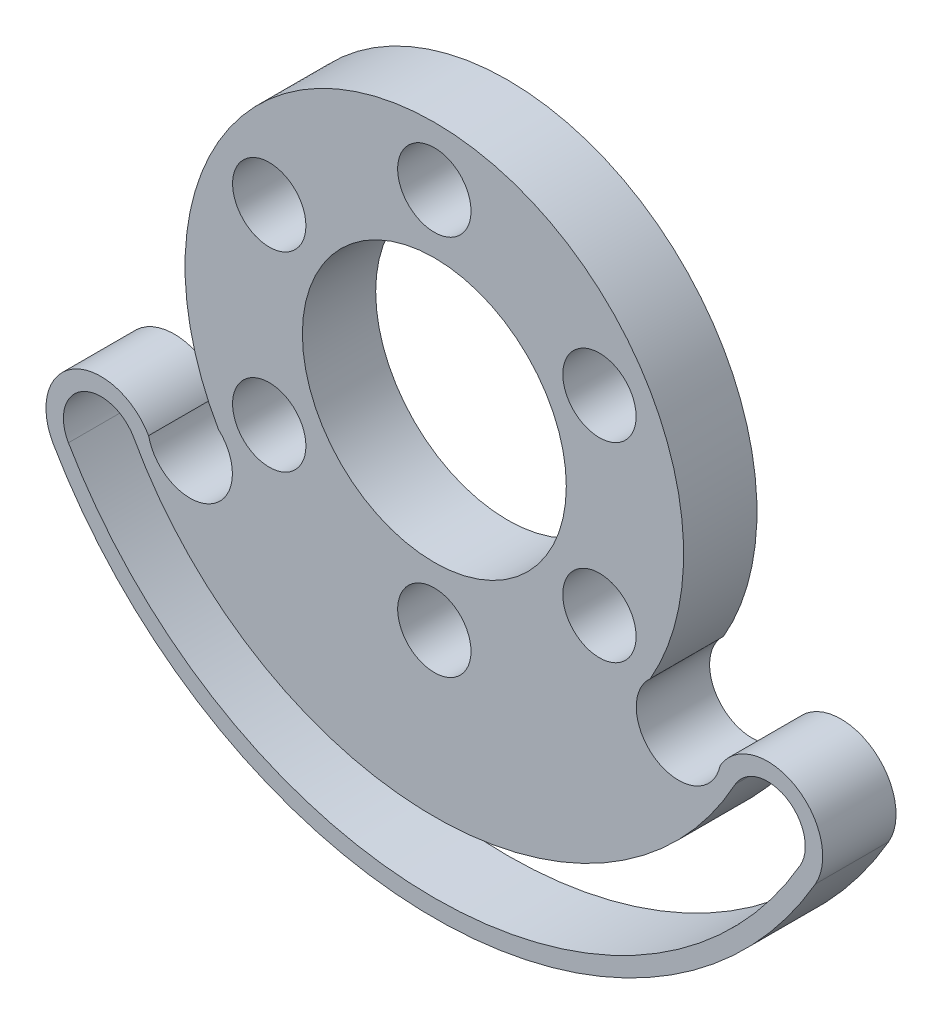
ISO-10303-21;
HEADER;
FILE_DESCRIPTION(('STEP AP214'),'2;1');
FILE_NAME('part.step','',(''),(''),'','','');
FILE_SCHEMA(('AUTOMOTIVE_DESIGN { 1 0 10303 214 1 1 1 1 }'));
ENDSEC;
DATA;
#1=APPLICATION_CONTEXT('core data for automotive mechanical design processes');
#2=APPLICATION_PROTOCOL_DEFINITION('international standard','automotive_design',2000,#1);
#3=PRODUCT_CONTEXT('',#1,'mechanical');
#4=PRODUCT('Part','Part','',(#3));
#5=PRODUCT_RELATED_PRODUCT_CATEGORY('part','',(#4));
#6=PRODUCT_DEFINITION_FORMATION('','',#4);
#7=PRODUCT_DEFINITION_CONTEXT('part definition',#1,'design');
#8=PRODUCT_DEFINITION('design','',#6,#7);
#9=PRODUCT_DEFINITION_SHAPE('','',#8);
#10=(LENGTH_UNIT() NAMED_UNIT(*) SI_UNIT(.MILLI.,.METRE.));
#11=(NAMED_UNIT(*) PLANE_ANGLE_UNIT() SI_UNIT($,.RADIAN.));
#12=(NAMED_UNIT(*) SI_UNIT($,.STERADIAN.) SOLID_ANGLE_UNIT());
#13=UNCERTAINTY_MEASURE_WITH_UNIT(LENGTH_MEASURE(1.E-05),#10,'distance_accuracy_value','');
#14=(GEOMETRIC_REPRESENTATION_CONTEXT(3) GLOBAL_UNCERTAINTY_ASSIGNED_CONTEXT((#13)) GLOBAL_UNIT_ASSIGNED_CONTEXT((#10,
#11,#12)) REPRESENTATION_CONTEXT('',''));
#15=CARTESIAN_POINT('',(0.,0.,0.));
#16=DIRECTION('',(0.,0.,1.));
#17=DIRECTION('',(1.,0.,0.));
#18=AXIS2_PLACEMENT_3D('',#15,#16,#17);
#19=CARTESIAN_POINT('',(0.,0.,-10.));
#20=DIRECTION('',(0.,0.,1.));
#21=DIRECTION('',(1.,0.,0.));
#22=AXIS2_PLACEMENT_3D('',#19,#20,#21);
#23=CYLINDRICAL_SURFACE('',#22,57.6241701090197);
#24=CARTESIAN_POINT('',(0.,0.,0.));
#25=DIRECTION('',(0.,0.,1.));
#26=DIRECTION('',(1.,0.,0.));
#27=AXIS2_PLACEMENT_3D('',#24,#25,#26);
#28=CIRCLE('',#27,57.6241701090197);
#29=CARTESIAN_POINT('',(-49.903995186407,-28.8120850545098,0.));
#30=VERTEX_POINT('',#29);
#31=CARTESIAN_POINT('',(49.903995186407,-28.8120850545099,0.));
#32=VERTEX_POINT('',#31);
#33=EDGE_CURVE('E185',#30,#32,#28,.T.);
#34=ORIENTED_EDGE('',*,*,#33,.T.);
#35=DIRECTION('',(0.,0.,1.));
#36=VECTOR('',#35,1.);
#37=CARTESIAN_POINT('',(49.903995186407,-28.8120850545099,-10.));
#38=LINE('',#37,#36);
#39=CARTESIAN_POINT('',(49.903995186407,-28.8120850545099,-10.));
#40=VERTEX_POINT('',#39);
#41=EDGE_CURVE('E11',#40,#32,#38,.T.);
#42=ORIENTED_EDGE('',*,*,#41,.F.);
#43=CARTESIAN_POINT('',(0.,0.,-10.));
#44=DIRECTION('',(0.,0.,1.));
#45=DIRECTION('',(1.,0.,0.));
#46=AXIS2_PLACEMENT_3D('',#43,#44,#45);
#47=CIRCLE('',#46,57.6241701090197);
#48=CARTESIAN_POINT('',(-49.903995186407,-28.8120850545098,-10.));
#49=VERTEX_POINT('',#48);
#50=EDGE_CURVE('E58',#49,#40,#47,.T.);
#51=ORIENTED_EDGE('',*,*,#50,.F.);
#52=DIRECTION('',(0.,0.,1.));
#53=VECTOR('',#52,1.);
#54=CARTESIAN_POINT('',(-49.903995186407,-28.8120850545098,-10.));
#55=LINE('',#54,#53);
#56=EDGE_CURVE('E133',#49,#30,#55,.T.);
#57=ORIENTED_EDGE('',*,*,#56,.T.);
#58=EDGE_LOOP('',(#34,#42,#51,#57));
#59=FACE_BOUND('',#58,.T.);
#60=ADVANCED_FACE('F39',(#59),#23,.F.);
#61=CARTESIAN_POINT('',(45.466333698683,-26.25,-10.));
#62=DIRECTION('',(0.,0.,1.));
#63=DIRECTION('',(1.,0.,0.));
#64=AXIS2_PLACEMENT_3D('',#61,#62,#63);
#65=CYLINDRICAL_SURFACE('',#64,5.12417010901976);
#66=CARTESIAN_POINT('',(45.466333698683,-26.25,0.));
#67=DIRECTION('',(0.,0.,1.));
#68=DIRECTION('',(1.,0.,0.));
#69=AXIS2_PLACEMENT_3D('',#66,#67,#68);
#70=CIRCLE('',#69,5.12417010901976);
#71=CARTESIAN_POINT('',(41.0286722109591,-23.6879149454901,0.));
#72=VERTEX_POINT('',#71);
#73=EDGE_CURVE('E190',#72,#32,#70,.F.);
#74=ORIENTED_EDGE('',*,*,#73,.F.);
#75=DIRECTION('',(0.,0.,1.));
#76=VECTOR('',#75,1.);
#77=CARTESIAN_POINT('',(41.0286722109591,-23.6879149454901,-10.));
#78=LINE('',#77,#76);
#79=CARTESIAN_POINT('',(41.0286722109591,-23.6879149454901,-10.));
#80=VERTEX_POINT('',#79);
#81=EDGE_CURVE('E49',#80,#72,#78,.T.);
#82=ORIENTED_EDGE('',*,*,#81,.F.);
#83=CARTESIAN_POINT('',(45.466333698683,-26.25,-10.));
#84=DIRECTION('',(0.,0.,1.));
#85=DIRECTION('',(1.,0.,0.));
#86=AXIS2_PLACEMENT_3D('',#83,#84,#85);
#87=CIRCLE('',#86,5.12417010901976);
#88=EDGE_CURVE('E138',#80,#40,#87,.F.);
#89=ORIENTED_EDGE('',*,*,#88,.T.);
#90=ORIENTED_EDGE('',*,*,#41,.T.);
#91=EDGE_LOOP('',(#74,#82,#89,#90));
#92=FACE_BOUND('',#91,.T.);
#93=ADVANCED_FACE('F240',(#92),#65,.F.);
#94=CARTESIAN_POINT('',(0.,-1.28493078490825,-10.));
#95=DIRECTION('',(0.,0.,1.));
#96=DIRECTION('',(1.,0.,0.));
#97=AXIS2_PLACEMENT_3D('',#94,#95,#96);
#98=CYLINDRICAL_SURFACE('',#97,46.7466110289677);
#99=CARTESIAN_POINT('',(0.,-1.28493078490825,0.));
#100=DIRECTION('',(0.,0.,1.));
#101=DIRECTION('',(1.,0.,0.));
#102=AXIS2_PLACEMENT_3D('',#99,#100,#101);
#103=CIRCLE('',#102,46.7466110289677);
#104=CARTESIAN_POINT('',(-41.0286722109591,-23.6879149454901,0.));
#105=VERTEX_POINT('',#104);
#106=EDGE_CURVE('E128',#105,#72,#103,.T.);
#107=ORIENTED_EDGE('',*,*,#106,.F.);
#108=DIRECTION('',(0.,0.,1.));
#109=VECTOR('',#108,1.);
#110=CARTESIAN_POINT('',(-41.0286722109591,-23.6879149454901,-10.));
#111=LINE('',#110,#109);
#112=CARTESIAN_POINT('',(-41.0286722109591,-23.6879149454901,-10.));
#113=VERTEX_POINT('',#112);
#114=EDGE_CURVE('E124',#113,#105,#111,.T.);
#115=ORIENTED_EDGE('',*,*,#114,.F.);
#116=CARTESIAN_POINT('',(0.,-1.28493078490825,-10.));
#117=DIRECTION('',(0.,0.,1.));
#118=DIRECTION('',(1.,0.,0.));
#119=AXIS2_PLACEMENT_3D('',#116,#117,#118);
#120=CIRCLE('',#119,46.7466110289677);
#121=EDGE_CURVE('E127',#113,#80,#120,.T.);
#122=ORIENTED_EDGE('',*,*,#121,.T.);
#123=ORIENTED_EDGE('',*,*,#81,.T.);
#124=EDGE_LOOP('',(#107,#115,#122,#123));
#125=FACE_BOUND('',#124,.T.);
#126=ADVANCED_FACE('F126',(#125),#98,.T.);
#127=CARTESIAN_POINT('',(33.3194090538244,-21.2890906406057,-10.));
#128=DIRECTION('',(0.,0.,1.));
#129=DIRECTION('',(1.,0.,0.));
#130=AXIS2_PLACEMENT_3D('',#127,#128,#129);
#131=CYLINDRICAL_SURFACE('',#130,5.77999999999998);
#132=CARTESIAN_POINT('',(33.3194090538244,-21.2890906406057,0.));
#133=DIRECTION('',(0.,0.,1.));
#134=DIRECTION('',(1.,0.,0.));
#135=AXIS2_PLACEMENT_3D('',#132,#133,#134);
#136=CIRCLE('',#135,5.77999999999998);
#137=CARTESIAN_POINT('',(29.4448637286708,-17.0000000000001,0.));
#138=VERTEX_POINT('',#137);
#139=CARTESIAN_POINT('',(38.9711431702997,-22.5,0.));
#140=VERTEX_POINT('',#139);
#141=EDGE_CURVE('E168',#138,#140,#136,.T.);
#142=ORIENTED_EDGE('',*,*,#141,.T.);
#143=DIRECTION('',(0.,0.,1.));
#144=VECTOR('',#143,1.);
#145=CARTESIAN_POINT('',(38.9711431702997,-22.5,-10.));
#146=LINE('',#145,#144);
#147=CARTESIAN_POINT('',(38.9711431702997,-22.5,-10.));
#148=VERTEX_POINT('',#147);
#149=EDGE_CURVE('E202',#148,#140,#146,.T.);
#150=ORIENTED_EDGE('',*,*,#149,.F.);
#151=CARTESIAN_POINT('',(33.3194090538244,-21.2890906406057,-10.));
#152=DIRECTION('',(0.,0.,1.));
#153=DIRECTION('',(1.,0.,0.));
#154=AXIS2_PLACEMENT_3D('',#151,#152,#153);
#155=CIRCLE('',#154,5.77999999999998);
#156=CARTESIAN_POINT('',(29.4448637286708,-17.0000000000001,-10.));
#157=VERTEX_POINT('',#156);
#158=EDGE_CURVE('E218',#157,#148,#155,.T.);
#159=ORIENTED_EDGE('',*,*,#158,.F.);
#160=DIRECTION('',(0.,0.,1.));
#161=VECTOR('',#160,1.);
#162=CARTESIAN_POINT('',(29.4448637286708,-17.0000000000001,-10.));
#163=LINE('',#162,#161);
#164=EDGE_CURVE('E43',#157,#138,#163,.T.);
#165=ORIENTED_EDGE('',*,*,#164,.T.);
#166=EDGE_LOOP('',(#142,#150,#159,#165));
#167=FACE_BOUND('',#166,.T.);
#168=ADVANCED_FACE('F215',(#167),#131,.F.);
#169=CARTESIAN_POINT('',(45.4663336986829,-26.2500000000002,-10.));
#170=DIRECTION('',(0.,0.,1.));
#171=DIRECTION('',(1.,0.,0.));
#172=AXIS2_PLACEMENT_3D('',#169,#170,#171);
#173=CYLINDRICAL_SURFACE('',#172,7.5);
#174=CARTESIAN_POINT('',(45.4663336986829,-26.2500000000002,0.));
#175=DIRECTION('',(0.,0.,1.));
#176=DIRECTION('',(1.,0.,0.));
#177=AXIS2_PLACEMENT_3D('',#174,#175,#176);
#178=CIRCLE('',#177,7.5);
#179=CARTESIAN_POINT('',(51.9615242270662,-30.0000000000003,0.));
#180=VERTEX_POINT('',#179);
#181=EDGE_CURVE('E182',#140,#180,#178,.F.);
#182=ORIENTED_EDGE('',*,*,#181,.T.);
#183=DIRECTION('',(0.,0.,1.));
#184=VECTOR('',#183,1.);
#185=CARTESIAN_POINT('',(51.9615242270662,-30.0000000000003,-10.));
#186=LINE('',#185,#184);
#187=CARTESIAN_POINT('',(51.9615242270662,-30.0000000000003,-10.));
#188=VERTEX_POINT('',#187);
#189=EDGE_CURVE('E205',#188,#180,#186,.T.);
#190=ORIENTED_EDGE('',*,*,#189,.F.);
#191=CARTESIAN_POINT('',(45.4663336986829,-26.2500000000002,-10.));
#192=DIRECTION('',(0.,0.,1.));
#193=DIRECTION('',(1.,0.,0.));
#194=AXIS2_PLACEMENT_3D('',#191,#192,#193);
#195=CIRCLE('',#194,7.5);
#196=EDGE_CURVE('E142',#148,#188,#195,.F.);
#197=ORIENTED_EDGE('',*,*,#196,.F.);
#198=ORIENTED_EDGE('',*,*,#149,.T.);
#199=EDGE_LOOP('',(#182,#190,#197,#198));
#200=FACE_BOUND('',#199,.T.);
#201=ADVANCED_FACE('F249',(#200),#173,.T.);
#202=CARTESIAN_POINT('',(0.,0.,-10.));
#203=DIRECTION('',(0.,0.,1.));
#204=DIRECTION('',(1.,0.,0.));
#205=AXIS2_PLACEMENT_3D('',#202,#203,#204);
#206=CYLINDRICAL_SURFACE('',#205,60.);
#207=CARTESIAN_POINT('',(0.,0.,0.));
#208=DIRECTION('',(0.,0.,1.));
#209=DIRECTION('',(1.,0.,0.));
#210=AXIS2_PLACEMENT_3D('',#207,#208,#209);
#211=CIRCLE('',#210,60.);
#212=CARTESIAN_POINT('',(-51.9615242270665,-29.9999999999997,0.));
#213=VERTEX_POINT('',#212);
#214=EDGE_CURVE('E179',#213,#180,#211,.T.);
#215=ORIENTED_EDGE('',*,*,#214,.F.);
#216=DIRECTION('',(0.,0.,1.));
#217=VECTOR('',#216,1.);
#218=CARTESIAN_POINT('',(-51.9615242270665,-29.9999999999997,-10.));
#219=LINE('',#218,#217);
#220=CARTESIAN_POINT('',(-51.9615242270665,-29.9999999999997,-10.));
#221=VERTEX_POINT('',#220);
#222=EDGE_CURVE('E207',#221,#213,#219,.T.);
#223=ORIENTED_EDGE('',*,*,#222,.F.);
#224=CARTESIAN_POINT('',(0.,0.,-10.));
#225=DIRECTION('',(0.,0.,1.));
#226=DIRECTION('',(1.,0.,0.));
#227=AXIS2_PLACEMENT_3D('',#224,#225,#226);
#228=CIRCLE('',#227,60.);
#229=EDGE_CURVE('E276',#221,#188,#228,.T.);
#230=ORIENTED_EDGE('',*,*,#229,.T.);
#231=ORIENTED_EDGE('',*,*,#189,.T.);
#232=EDGE_LOOP('',(#215,#223,#230,#231));
#233=FACE_BOUND('',#232,.T.);
#234=ADVANCED_FACE('F252',(#233),#206,.T.);
#235=CARTESIAN_POINT('',(-45.4663336986831,-26.2499999999998,-10.));
#236=DIRECTION('',(0.,0.,1.));
#237=DIRECTION('',(1.,0.,0.));
#238=AXIS2_PLACEMENT_3D('',#235,#236,#237);
#239=CYLINDRICAL_SURFACE('',#238,7.49999999999999);
#240=CARTESIAN_POINT('',(-45.4663336986831,-26.2499999999998,0.));
#241=DIRECTION('',(0.,0.,1.));
#242=DIRECTION('',(1.,0.,0.));
#243=AXIS2_PLACEMENT_3D('',#240,#241,#242);
#244=CIRCLE('',#243,7.49999999999999);
#245=CARTESIAN_POINT('',(-38.9711431702997,-22.5,0.));
#246=VERTEX_POINT('',#245);
#247=EDGE_CURVE('E177',#213,#246,#244,.F.);
#248=ORIENTED_EDGE('',*,*,#247,.T.);
#249=DIRECTION('',(0.,0.,1.));
#250=VECTOR('',#249,1.);
#251=CARTESIAN_POINT('',(-38.9711431702997,-22.5,-10.));
#252=LINE('',#251,#250);
#253=CARTESIAN_POINT('',(-38.9711431702997,-22.5,-10.));
#254=VERTEX_POINT('',#253);
#255=EDGE_CURVE('E209',#254,#246,#252,.T.);
#256=ORIENTED_EDGE('',*,*,#255,.F.);
#257=CARTESIAN_POINT('',(-45.4663336986831,-26.2499999999998,-10.));
#258=DIRECTION('',(0.,0.,1.));
#259=DIRECTION('',(1.,0.,0.));
#260=AXIS2_PLACEMENT_3D('',#257,#258,#259);
#261=CIRCLE('',#260,7.49999999999999);
#262=EDGE_CURVE('E289',#221,#254,#261,.F.);
#263=ORIENTED_EDGE('',*,*,#262,.F.);
#264=ORIENTED_EDGE('',*,*,#222,.T.);
#265=EDGE_LOOP('',(#248,#256,#263,#264));
#266=FACE_BOUND('',#265,.T.);
#267=ADVANCED_FACE('F256',(#266),#239,.T.);
#268=CARTESIAN_POINT('',(-33.3219081509298,-21.2847620774461,-10.));
#269=DIRECTION('',(0.,0.,1.));
#270=DIRECTION('',(1.,0.,0.));
#271=AXIS2_PLACEMENT_3D('',#268,#269,#270);
#272=CYLINDRICAL_SURFACE('',#271,5.77846515196629);
#273=CARTESIAN_POINT('',(-33.3219081509298,-21.2847620774461,0.));
#274=DIRECTION('',(0.,0.,1.));
#275=DIRECTION('',(1.,0.,0.));
#276=AXIS2_PLACEMENT_3D('',#273,#274,#275);
#277=CIRCLE('',#276,5.77846515196629);
#278=CARTESIAN_POINT('',(-29.444863728671,-16.9999999999999,0.));
#279=VERTEX_POINT('',#278);
#280=EDGE_CURVE('E174',#246,#279,#277,.T.);
#281=ORIENTED_EDGE('',*,*,#280,.T.);
#282=DIRECTION('',(0.,0.,1.));
#283=VECTOR('',#282,1.);
#284=CARTESIAN_POINT('',(-29.444863728671,-16.9999999999999,-10.));
#285=LINE('',#284,#283);
#286=CARTESIAN_POINT('',(-29.444863728671,-16.9999999999999,-10.));
#287=VERTEX_POINT('',#286);
#288=EDGE_CURVE('E211',#287,#279,#285,.T.);
#289=ORIENTED_EDGE('',*,*,#288,.F.);
#290=CARTESIAN_POINT('',(-33.3219081509298,-21.2847620774461,-10.));
#291=DIRECTION('',(0.,0.,1.));
#292=DIRECTION('',(1.,0.,0.));
#293=AXIS2_PLACEMENT_3D('',#290,#291,#292);
#294=CIRCLE('',#293,5.77846515196629);
#295=EDGE_CURVE('E281',#254,#287,#294,.T.);
#296=ORIENTED_EDGE('',*,*,#295,.F.);
#297=ORIENTED_EDGE('',*,*,#255,.T.);
#298=EDGE_LOOP('',(#281,#289,#296,#297));
#299=FACE_BOUND('',#298,.T.);
#300=ADVANCED_FACE('F259',(#299),#272,.F.);
#301=CARTESIAN_POINT('',(-22.5166604983955,-12.9999999999998,-10.));
#302=DIRECTION('',(0.,0.,1.));
#303=DIRECTION('',(1.,0.,0.));
#304=AXIS2_PLACEMENT_3D('',#301,#302,#303);
#305=CYLINDRICAL_SURFACE('',#304,5.);
#306=CARTESIAN_POINT('',(-22.5166604983955,-12.9999999999998,-10.));
#307=DIRECTION('',(0.,0.,1.));
#308=DIRECTION('',(1.,0.,0.));
#309=AXIS2_PLACEMENT_3D('',#306,#307,#308);
#310=CIRCLE('',#309,5.);
#311=CARTESIAN_POINT('',(-17.5166604983955,-12.9999999999998,-10.));
#312=VERTEX_POINT('',#311);
#313=EDGE_CURVE('E147',#312,#312,#310,.T.);
#314=ORIENTED_EDGE('',*,*,#313,.F.);
#315=EDGE_LOOP('',(#314));
#316=FACE_BOUND('',#315,.T.);
#317=CARTESIAN_POINT('',(-22.5166604983955,-12.9999999999998,0.));
#318=DIRECTION('',(0.,0.,1.));
#319=DIRECTION('',(1.,0.,0.));
#320=AXIS2_PLACEMENT_3D('',#317,#318,#319);
#321=CIRCLE('',#320,5.);
#322=CARTESIAN_POINT('',(-17.5166604983955,-12.9999999999998,0.));
#323=VERTEX_POINT('',#322);
#324=EDGE_CURVE('E193',#323,#323,#321,.T.);
#325=ORIENTED_EDGE('',*,*,#324,.T.);
#326=EDGE_LOOP('',(#325));
#327=FACE_BOUND('',#326,.T.);
#328=ADVANCED_FACE('F235',(#316,#327),#305,.F.);
#329=CARTESIAN_POINT('',(-45.466333698683,-26.25,-10.));
#330=DIRECTION('',(0.,0.,1.));
#331=DIRECTION('',(1.,0.,0.));
#332=AXIS2_PLACEMENT_3D('',#329,#330,#331);
#333=CYLINDRICAL_SURFACE('',#332,5.12417010901974);
#334=CARTESIAN_POINT('',(-45.466333698683,-26.25,0.));
#335=DIRECTION('',(0.,0.,1.));
#336=DIRECTION('',(1.,0.,0.));
#337=AXIS2_PLACEMENT_3D('',#334,#335,#336);
#338=CIRCLE('',#337,5.12417010901974);
#339=EDGE_CURVE('E187',#30,#105,#338,.F.);
#340=ORIENTED_EDGE('',*,*,#339,.F.);
#341=ORIENTED_EDGE('',*,*,#56,.F.);
#342=CARTESIAN_POINT('',(-45.466333698683,-26.25,-10.));
#343=DIRECTION('',(0.,0.,1.));
#344=DIRECTION('',(1.,0.,0.));
#345=AXIS2_PLACEMENT_3D('',#342,#343,#344);
#346=CIRCLE('',#345,5.12417010901974);
#347=EDGE_CURVE('E137',#49,#113,#346,.F.);
#348=ORIENTED_EDGE('',*,*,#347,.T.);
#349=ORIENTED_EDGE('',*,*,#114,.T.);
#350=EDGE_LOOP('',(#340,#341,#348,#349));
#351=FACE_BOUND('',#350,.T.);
#352=ADVANCED_FACE('F140',(#351),#333,.F.);
#353=CARTESIAN_POINT('',(0.,0.,-10.));
#354=DIRECTION('',(0.,0.,1.));
#355=DIRECTION('',(1.,0.,0.));
#356=AXIS2_PLACEMENT_3D('',#353,#354,#355);
#357=CYLINDRICAL_SURFACE('',#356,34.);
#358=CARTESIAN_POINT('',(0.,0.,0.));
#359=DIRECTION('',(0.,0.,1.));
#360=DIRECTION('',(1.,0.,0.));
#361=AXIS2_PLACEMENT_3D('',#358,#359,#360);
#362=CIRCLE('',#361,34.);
#363=EDGE_CURVE('E171',#138,#279,#362,.T.);
#364=ORIENTED_EDGE('',*,*,#363,.F.);
#365=ORIENTED_EDGE('',*,*,#164,.F.);
#366=CARTESIAN_POINT('',(0.,0.,-10.));
#367=DIRECTION('',(0.,0.,1.));
#368=DIRECTION('',(1.,0.,0.));
#369=AXIS2_PLACEMENT_3D('',#366,#367,#368);
#370=CIRCLE('',#369,34.);
#371=EDGE_CURVE('E278',#157,#287,#370,.T.);
#372=ORIENTED_EDGE('',*,*,#371,.T.);
#373=ORIENTED_EDGE('',*,*,#288,.T.);
#374=EDGE_LOOP('',(#364,#365,#372,#373));
#375=FACE_BOUND('',#374,.T.);
#376=ADVANCED_FACE('F224',(#375),#357,.T.);
#377=CARTESIAN_POINT('',(-1.81557029619843E-13,-26.,-10.));
#378=DIRECTION('',(0.,0.,1.));
#379=DIRECTION('',(1.,0.,0.));
#380=AXIS2_PLACEMENT_3D('',#377,#378,#379);
#381=CYLINDRICAL_SURFACE('',#380,5.);
#382=CARTESIAN_POINT('',(-1.81557029619843E-13,-26.,-10.));
#383=DIRECTION('',(0.,0.,1.));
#384=DIRECTION('',(1.,0.,0.));
#385=AXIS2_PLACEMENT_3D('',#382,#383,#384);
#386=CIRCLE('',#385,5.);
#387=CARTESIAN_POINT('',(4.99999999999982,-26.,-10.));
#388=VERTEX_POINT('',#387);
#389=EDGE_CURVE('E279',#388,#388,#386,.T.);
#390=ORIENTED_EDGE('',*,*,#389,.F.);
#391=EDGE_LOOP('',(#390));
#392=FACE_BOUND('',#391,.T.);
#393=CARTESIAN_POINT('',(-1.81557029619843E-13,-26.,0.));
#394=DIRECTION('',(0.,0.,1.));
#395=DIRECTION('',(1.,0.,0.));
#396=AXIS2_PLACEMENT_3D('',#393,#394,#395);
#397=CIRCLE('',#396,5.);
#398=CARTESIAN_POINT('',(4.99999999999982,-26.,0.));
#399=VERTEX_POINT('',#398);
#400=EDGE_CURVE('E165',#399,#399,#397,.T.);
#401=ORIENTED_EDGE('',*,*,#400,.T.);
#402=EDGE_LOOP('',(#401));
#403=FACE_BOUND('',#402,.T.);
#404=ADVANCED_FACE('F226',(#392,#403),#381,.F.);
#405=CARTESIAN_POINT('',(22.5166604983953,-13.0000000000001,-10.));
#406=DIRECTION('',(0.,0.,1.));
#407=DIRECTION('',(1.,0.,0.));
#408=AXIS2_PLACEMENT_3D('',#405,#406,#407);
#409=CYLINDRICAL_SURFACE('',#408,5.);
#410=CARTESIAN_POINT('',(22.5166604983953,-13.0000000000001,-10.));
#411=DIRECTION('',(0.,0.,1.));
#412=DIRECTION('',(1.,0.,0.));
#413=AXIS2_PLACEMENT_3D('',#410,#411,#412);
#414=CIRCLE('',#413,5.);
#415=CARTESIAN_POINT('',(27.5166604983953,-13.0000000000001,-10.));
#416=VERTEX_POINT('',#415);
#417=EDGE_CURVE('E284',#416,#416,#414,.T.);
#418=ORIENTED_EDGE('',*,*,#417,.F.);
#419=EDGE_LOOP('',(#418));
#420=FACE_BOUND('',#419,.T.);
#421=CARTESIAN_POINT('',(22.5166604983953,-13.0000000000001,0.));
#422=DIRECTION('',(0.,0.,1.));
#423=DIRECTION('',(1.,0.,0.));
#424=AXIS2_PLACEMENT_3D('',#421,#422,#423);
#425=CIRCLE('',#424,5.);
#426=CARTESIAN_POINT('',(27.5166604983953,-13.0000000000001,0.));
#427=VERTEX_POINT('',#426);
#428=EDGE_CURVE('E162',#427,#427,#425,.T.);
#429=ORIENTED_EDGE('',*,*,#428,.T.);
#430=EDGE_LOOP('',(#429));
#431=FACE_BOUND('',#430,.T.);
#432=ADVANCED_FACE('F232',(#420,#431),#409,.F.);
#433=CARTESIAN_POINT('',(22.5166604983954,12.9999999999999,-10.));
#434=DIRECTION('',(0.,0.,1.));
#435=DIRECTION('',(1.,0.,0.));
#436=AXIS2_PLACEMENT_3D('',#433,#434,#435);
#437=CYLINDRICAL_SURFACE('',#436,5.);
#438=CARTESIAN_POINT('',(22.5166604983954,12.9999999999999,-10.));
#439=DIRECTION('',(0.,0.,1.));
#440=DIRECTION('',(1.,0.,0.));
#441=AXIS2_PLACEMENT_3D('',#438,#439,#440);
#442=CIRCLE('',#441,5.);
#443=CARTESIAN_POINT('',(27.5166604983954,12.9999999999999,-10.));
#444=VERTEX_POINT('',#443);
#445=EDGE_CURVE('E293',#444,#444,#442,.T.);
#446=ORIENTED_EDGE('',*,*,#445,.F.);
#447=EDGE_LOOP('',(#446));
#448=FACE_BOUND('',#447,.T.);
#449=CARTESIAN_POINT('',(22.5166604983954,12.9999999999999,0.));
#450=DIRECTION('',(0.,0.,1.));
#451=DIRECTION('',(1.,0.,0.));
#452=AXIS2_PLACEMENT_3D('',#449,#450,#451);
#453=CIRCLE('',#452,5.);
#454=CARTESIAN_POINT('',(27.5166604983954,12.9999999999999,0.));
#455=VERTEX_POINT('',#454);
#456=EDGE_CURVE('E159',#455,#455,#453,.T.);
#457=ORIENTED_EDGE('',*,*,#456,.T.);
#458=EDGE_LOOP('',(#457));
#459=FACE_BOUND('',#458,.T.);
#460=ADVANCED_FACE('F323',(#448,#459),#437,.F.);
#461=CARTESIAN_POINT('',(0.,26.,-10.));
#462=DIRECTION('',(0.,0.,1.));
#463=DIRECTION('',(1.,0.,0.));
#464=AXIS2_PLACEMENT_3D('',#461,#462,#463);
#465=CYLINDRICAL_SURFACE('',#464,5.);
#466=CARTESIAN_POINT('',(0.,26.,-10.));
#467=DIRECTION('',(0.,0.,1.));
#468=DIRECTION('',(1.,0.,0.));
#469=AXIS2_PLACEMENT_3D('',#466,#467,#468);
#470=CIRCLE('',#469,5.);
#471=CARTESIAN_POINT('',(5.,26.,-10.));
#472=VERTEX_POINT('',#471);
#473=EDGE_CURVE('E296',#472,#472,#470,.T.);
#474=ORIENTED_EDGE('',*,*,#473,.F.);
#475=EDGE_LOOP('',(#474));
#476=FACE_BOUND('',#475,.T.);
#477=CARTESIAN_POINT('',(0.,26.,0.));
#478=DIRECTION('',(0.,0.,1.));
#479=DIRECTION('',(1.,0.,0.));
#480=AXIS2_PLACEMENT_3D('',#477,#478,#479);
#481=CIRCLE('',#480,5.);
#482=CARTESIAN_POINT('',(5.,26.,0.));
#483=VERTEX_POINT('',#482);
#484=EDGE_CURVE('E156',#483,#483,#481,.T.);
#485=ORIENTED_EDGE('',*,*,#484,.T.);
#486=EDGE_LOOP('',(#485));
#487=FACE_BOUND('',#486,.T.);
#488=ADVANCED_FACE('F307',(#476,#487),#465,.F.);
#489=CARTESIAN_POINT('',(-22.5166604983953,13.0000000000003,-10.));
#490=DIRECTION('',(0.,0.,1.));
#491=DIRECTION('',(1.,0.,0.));
#492=AXIS2_PLACEMENT_3D('',#489,#490,#491);
#493=CYLINDRICAL_SURFACE('',#492,5.);
#494=CARTESIAN_POINT('',(-22.5166604983953,13.0000000000003,-10.));
#495=DIRECTION('',(0.,0.,1.));
#496=DIRECTION('',(1.,0.,0.));
#497=AXIS2_PLACEMENT_3D('',#494,#495,#496);
#498=CIRCLE('',#497,5.);
#499=CARTESIAN_POINT('',(-17.5166604983953,13.0000000000003,-10.));
#500=VERTEX_POINT('',#499);
#501=EDGE_CURVE('E198',#500,#500,#498,.T.);
#502=ORIENTED_EDGE('',*,*,#501,.F.);
#503=EDGE_LOOP('',(#502));
#504=FACE_BOUND('',#503,.T.);
#505=CARTESIAN_POINT('',(-22.5166604983953,13.0000000000003,0.));
#506=DIRECTION('',(0.,0.,1.));
#507=DIRECTION('',(1.,0.,0.));
#508=AXIS2_PLACEMENT_3D('',#505,#506,#507);
#509=CIRCLE('',#508,5.);
#510=CARTESIAN_POINT('',(-17.5166604983953,13.0000000000003,0.));
#511=VERTEX_POINT('',#510);
#512=EDGE_CURVE('E153',#511,#511,#509,.T.);
#513=ORIENTED_EDGE('',*,*,#512,.T.);
#514=EDGE_LOOP('',(#513));
#515=FACE_BOUND('',#514,.T.);
#516=ADVANCED_FACE('F41',(#504,#515),#493,.F.);
#517=CARTESIAN_POINT('',(0.,0.,-10.));
#518=DIRECTION('',(0.,0.,1.));
#519=DIRECTION('',(1.,0.,0.));
#520=AXIS2_PLACEMENT_3D('',#517,#518,#519);
#521=CYLINDRICAL_SURFACE('',#520,18.);
#522=CARTESIAN_POINT('',(0.,0.,-10.));
#523=DIRECTION('',(0.,0.,1.));
#524=DIRECTION('',(1.,0.,0.));
#525=AXIS2_PLACEMENT_3D('',#522,#523,#524);
#526=CIRCLE('',#525,18.);
#527=CARTESIAN_POINT('',(18.,0.,-10.));
#528=VERTEX_POINT('',#527);
#529=EDGE_CURVE('E150',#528,#528,#526,.T.);
#530=ORIENTED_EDGE('',*,*,#529,.F.);
#531=EDGE_LOOP('',(#530));
#532=FACE_BOUND('',#531,.T.);
#533=CARTESIAN_POINT('',(0.,0.,0.));
#534=DIRECTION('',(0.,0.,1.));
#535=DIRECTION('',(1.,0.,0.));
#536=AXIS2_PLACEMENT_3D('',#533,#534,#535);
#537=CIRCLE('',#536,18.);
#538=CARTESIAN_POINT('',(18.,0.,0.));
#539=VERTEX_POINT('',#538);
#540=EDGE_CURVE('E196',#539,#539,#537,.T.);
#541=ORIENTED_EDGE('',*,*,#540,.T.);
#542=EDGE_LOOP('',(#541));
#543=FACE_BOUND('',#542,.T.);
#544=ADVANCED_FACE('F306',(#532,#543),#521,.F.);
#545=CARTESIAN_POINT('',(0.,0.,-10.));
#546=DIRECTION('',(0.,0.,1.));
#547=DIRECTION('',(1.,0.,0.));
#548=AXIS2_PLACEMENT_3D('',#545,#546,#547);
#549=PLANE('',#548);
#550=ORIENTED_EDGE('',*,*,#501,.T.);
#551=EDGE_LOOP('',(#550));
#552=FACE_BOUND('',#551,.T.);
#553=ORIENTED_EDGE('',*,*,#473,.T.);
#554=EDGE_LOOP('',(#553));
#555=FACE_BOUND('',#554,.T.);
#556=ORIENTED_EDGE('',*,*,#445,.T.);
#557=EDGE_LOOP('',(#556));
#558=FACE_BOUND('',#557,.T.);
#559=ORIENTED_EDGE('',*,*,#417,.T.);
#560=EDGE_LOOP('',(#559));
#561=FACE_BOUND('',#560,.T.);
#562=ORIENTED_EDGE('',*,*,#389,.T.);
#563=EDGE_LOOP('',(#562));
#564=FACE_BOUND('',#563,.T.);
#565=ORIENTED_EDGE('',*,*,#158,.T.);
#566=ORIENTED_EDGE('',*,*,#196,.T.);
#567=ORIENTED_EDGE('',*,*,#229,.F.);
#568=ORIENTED_EDGE('',*,*,#262,.T.);
#569=ORIENTED_EDGE('',*,*,#295,.T.);
#570=ORIENTED_EDGE('',*,*,#371,.F.);
#571=EDGE_LOOP('',(#565,#566,#567,#568,#569,#570));
#572=FACE_BOUND('',#571,.T.);
#573=ORIENTED_EDGE('',*,*,#50,.T.);
#574=ORIENTED_EDGE('',*,*,#88,.F.);
#575=ORIENTED_EDGE('',*,*,#121,.F.);
#576=ORIENTED_EDGE('',*,*,#347,.F.);
#577=EDGE_LOOP('',(#573,#574,#575,#576));
#578=FACE_BOUND('',#577,.T.);
#579=ORIENTED_EDGE('',*,*,#313,.T.);
#580=EDGE_LOOP('',(#579));
#581=FACE_BOUND('',#580,.T.);
#582=ORIENTED_EDGE('',*,*,#529,.T.);
#583=EDGE_LOOP('',(#582));
#584=FACE_BOUND('',#583,.T.);
#585=ADVANCED_FACE('F135',(#552,#555,#558,#561,#564,#572,#578,#581,#584),#549,.F.);
#586=CARTESIAN_POINT('',(0.,0.,0.));
#587=DIRECTION('',(0.,0.,1.));
#588=DIRECTION('',(1.,0.,0.));
#589=AXIS2_PLACEMENT_3D('',#586,#587,#588);
#590=PLANE('',#589);
#591=ORIENTED_EDGE('',*,*,#512,.F.);
#592=EDGE_LOOP('',(#591));
#593=FACE_BOUND('',#592,.T.);
#594=ORIENTED_EDGE('',*,*,#484,.F.);
#595=EDGE_LOOP('',(#594));
#596=FACE_BOUND('',#595,.T.);
#597=ORIENTED_EDGE('',*,*,#456,.F.);
#598=EDGE_LOOP('',(#597));
#599=FACE_BOUND('',#598,.T.);
#600=ORIENTED_EDGE('',*,*,#428,.F.);
#601=EDGE_LOOP('',(#600));
#602=FACE_BOUND('',#601,.T.);
#603=ORIENTED_EDGE('',*,*,#400,.F.);
#604=EDGE_LOOP('',(#603));
#605=FACE_BOUND('',#604,.T.);
#606=ORIENTED_EDGE('',*,*,#141,.F.);
#607=ORIENTED_EDGE('',*,*,#363,.T.);
#608=ORIENTED_EDGE('',*,*,#280,.F.);
#609=ORIENTED_EDGE('',*,*,#247,.F.);
#610=ORIENTED_EDGE('',*,*,#214,.T.);
#611=ORIENTED_EDGE('',*,*,#181,.F.);
#612=EDGE_LOOP('',(#606,#607,#608,#609,#610,#611));
#613=FACE_BOUND('',#612,.T.);
#614=ORIENTED_EDGE('',*,*,#33,.F.);
#615=ORIENTED_EDGE('',*,*,#339,.T.);
#616=ORIENTED_EDGE('',*,*,#106,.T.);
#617=ORIENTED_EDGE('',*,*,#73,.T.);
#618=EDGE_LOOP('',(#614,#615,#616,#617));
#619=FACE_BOUND('',#618,.T.);
#620=ORIENTED_EDGE('',*,*,#324,.F.);
#621=EDGE_LOOP('',(#620));
#622=FACE_BOUND('',#621,.T.);
#623=ORIENTED_EDGE('',*,*,#540,.F.);
#624=EDGE_LOOP('',(#623));
#625=FACE_BOUND('',#624,.T.);
#626=ADVANCED_FACE('F221',(#593,#596,#599,#602,#605,#613,#619,#622,#625),#590,.T.);
#627=CLOSED_SHELL('',(#60,#93,#126,#168,#201,#234,#267,#300,#328,#352,#376,#404,#432,#460,#488,
#516,#544,#585,#626));
#628=MANIFOLD_SOLID_BREP('B2',#627);
#629=ADVANCED_BREP_SHAPE_REPRESENTATION('',(#18,#628),#14);
#630=SHAPE_DEFINITION_REPRESENTATION(#9,#629);
ENDSEC;
END-ISO-10303-21;
